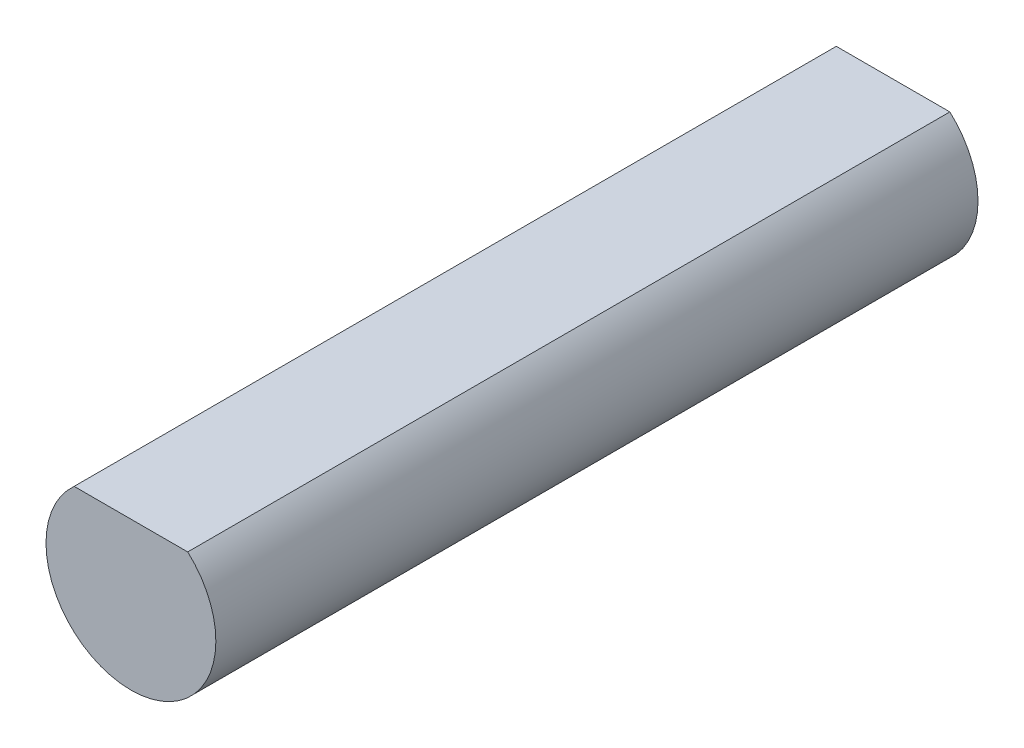
ISO-10303-21;
HEADER;
FILE_DESCRIPTION(('STEP AP214'),'2;1');
FILE_NAME('part.step','',(''),(''),'','','');
FILE_SCHEMA(('AUTOMOTIVE_DESIGN { 1 0 10303 214 1 1 1 1 }'));
ENDSEC;
DATA;
#1=APPLICATION_CONTEXT('core data for automotive mechanical design processes');
#2=APPLICATION_PROTOCOL_DEFINITION('international standard','automotive_design',2000,#1);
#3=PRODUCT_CONTEXT('',#1,'mechanical');
#4=PRODUCT('Part','Part','',(#3));
#5=PRODUCT_RELATED_PRODUCT_CATEGORY('part','',(#4));
#6=PRODUCT_DEFINITION_FORMATION('','',#4);
#7=PRODUCT_DEFINITION_CONTEXT('part definition',#1,'design');
#8=PRODUCT_DEFINITION('design','',#6,#7);
#9=PRODUCT_DEFINITION_SHAPE('','',#8);
#10=(LENGTH_UNIT() NAMED_UNIT(*) SI_UNIT(.MILLI.,.METRE.));
#11=(NAMED_UNIT(*) PLANE_ANGLE_UNIT() SI_UNIT($,.RADIAN.));
#12=(NAMED_UNIT(*) SI_UNIT($,.STERADIAN.) SOLID_ANGLE_UNIT());
#13=UNCERTAINTY_MEASURE_WITH_UNIT(LENGTH_MEASURE(1.E-05),#10,'distance_accuracy_value','');
#14=(GEOMETRIC_REPRESENTATION_CONTEXT(3) GLOBAL_UNCERTAINTY_ASSIGNED_CONTEXT((#13)) GLOBAL_UNIT_ASSIGNED_CONTEXT((#10,
#11,#12)) REPRESENTATION_CONTEXT('',''));
#15=CARTESIAN_POINT('',(0.,0.,0.));
#16=DIRECTION('',(0.,0.,1.));
#17=DIRECTION('',(1.,0.,0.));
#18=AXIS2_PLACEMENT_3D('',#15,#16,#17);
#19=CARTESIAN_POINT('',(0.,-1.11022302462516E-13,34.9999999999999));
#20=DIRECTION('',(0.,0.,-0.999999999999969));
#21=DIRECTION('',(-1.00000000000002,0.,0.));
#22=AXIS2_PLACEMENT_3D('',#19,#20,#21);
#23=CYLINDRICAL_SURFACE('',#22,3.9);
#24=CARTESIAN_POINT('',(0.,-1.11022302462516E-13,34.9999999999999));
#25=DIRECTION('',(0.,0.,0.999999999999969));
#26=DIRECTION('',(1.00000000000002,0.,0.));
#27=AXIS2_PLACEMENT_3D('',#24,#25,#26);
#28=CIRCLE('',#27,3.9);
#29=CARTESIAN_POINT('',(-2.60768096208081,2.89999999999982,34.9999999999995));
#30=VERTEX_POINT('',#29);
#31=CARTESIAN_POINT('',(2.60768096208103,2.89999999999926,34.9999999999983));
#32=VERTEX_POINT('',#31);
#33=EDGE_CURVE('E40',#30,#32,#28,.T.);
#34=ORIENTED_EDGE('',*,*,#33,.F.);
#35=DIRECTION('',(0.,0.,-0.999999999999969));
#36=VECTOR('',#35,1.);
#37=CARTESIAN_POINT('',(-2.60768096208081,2.89999999999982,34.9999999999995));
#38=LINE('',#37,#36);
#39=CARTESIAN_POINT('',(-2.60768096208111,2.89999999999954,0.));
#40=VERTEX_POINT('',#39);
#41=EDGE_CURVE('E54',#30,#40,#38,.T.);
#42=ORIENTED_EDGE('',*,*,#41,.T.);
#43=CARTESIAN_POINT('',(0.,0.,0.));
#44=DIRECTION('',(0.,0.,0.999999999999969));
#45=DIRECTION('',(1.00000000000002,0.,0.));
#46=AXIS2_PLACEMENT_3D('',#43,#44,#45);
#47=CIRCLE('',#46,3.9);
#48=CARTESIAN_POINT('',(2.60768096208106,2.89999999999999,0.));
#49=VERTEX_POINT('',#48);
#50=EDGE_CURVE('E62',#40,#49,#47,.T.);
#51=ORIENTED_EDGE('',*,*,#50,.T.);
#52=DIRECTION('',(0.,0.,-0.999999999999969));
#53=VECTOR('',#52,1.);
#54=CARTESIAN_POINT('',(2.60768096208103,2.89999999999926,34.9999999999983));
#55=LINE('',#54,#53);
#56=EDGE_CURVE('E47',#49,#32,#55,.F.);
#57=ORIENTED_EDGE('',*,*,#56,.T.);
#58=EDGE_LOOP('',(#34,#42,#51,#57));
#59=FACE_BOUND('',#58,.T.);
#60=ADVANCED_FACE('F33',(#59),#23,.T.);
#61=CARTESIAN_POINT('',(0.,-1.11022302462516E-13,34.9999999999999));
#62=DIRECTION('',(0.,0.,0.999999999999969));
#63=DIRECTION('',(1.00000000000002,0.,0.));
#64=AXIS2_PLACEMENT_3D('',#61,#62,#63);
#65=PLANE('',#64);
#66=DIRECTION('',(1.00000000000002,0.,0.));
#67=VECTOR('',#66,1.);
#68=CARTESIAN_POINT('',(-5.34168814336758,2.89999999999993,34.9999999999991));
#69=LINE('',#68,#67);
#70=EDGE_CURVE('E57',#30,#32,#69,.T.);
#71=ORIENTED_EDGE('',*,*,#70,.F.);
#72=ORIENTED_EDGE('',*,*,#33,.T.);
#73=EDGE_LOOP('',(#71,#72));
#74=FACE_BOUND('',#73,.T.);
#75=ADVANCED_FACE('F66',(#74),#65,.T.);
#76=CARTESIAN_POINT('',(0.,0.,0.));
#77=DIRECTION('',(0.,0.,0.999999999999969));
#78=DIRECTION('',(1.00000000000002,0.,0.));
#79=AXIS2_PLACEMENT_3D('',#76,#77,#78);
#80=PLANE('',#79);
#81=ORIENTED_EDGE('',*,*,#50,.F.);
#82=DIRECTION('',(1.00000000000002,0.,0.));
#83=VECTOR('',#82,1.);
#84=CARTESIAN_POINT('',(2.4980018054066E-13,2.89999999999999,0.));
#85=LINE('',#84,#83);
#86=EDGE_CURVE('E11',#40,#49,#85,.T.);
#87=ORIENTED_EDGE('',*,*,#86,.T.);
#88=EDGE_LOOP('',(#81,#87));
#89=FACE_BOUND('',#88,.T.);
#90=ADVANCED_FACE('F71',(#89),#80,.F.);
#91=CARTESIAN_POINT('',(-5.34168814336752,2.90000000000004,-1.04083408558608E-13));
#92=DIRECTION('',(0.,-1.00000000000002,0.));
#93=DIRECTION('',(0.,0.,-0.999999999999969));
#94=AXIS2_PLACEMENT_3D('',#91,#92,#93);
#95=PLANE('',#94);
#96=ORIENTED_EDGE('',*,*,#70,.T.);
#97=ORIENTED_EDGE('',*,*,#56,.F.);
#98=ORIENTED_EDGE('',*,*,#86,.F.);
#99=ORIENTED_EDGE('',*,*,#41,.F.);
#100=EDGE_LOOP('',(#96,#97,#98,#99));
#101=FACE_BOUND('',#100,.T.);
#102=ADVANCED_FACE('F56',(#101),#95,.F.);
#103=CLOSED_SHELL('',(#60,#75,#90,#102));
#104=MANIFOLD_SOLID_BREP('B2',#103);
#105=ADVANCED_BREP_SHAPE_REPRESENTATION('',(#18,#104),#14);
#106=SHAPE_DEFINITION_REPRESENTATION(#9,#105);
ENDSEC;
END-ISO-10303-21;
